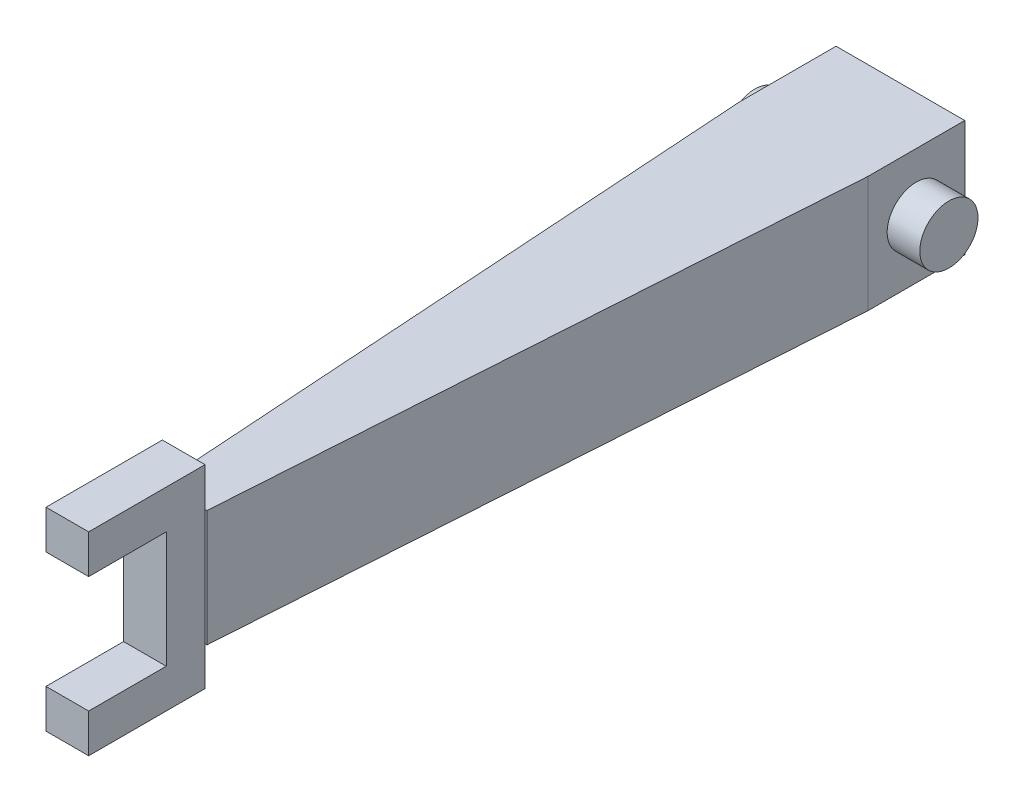
ISO-10303-21;
HEADER;
FILE_DESCRIPTION(('STEP AP214'),'2;1');
FILE_NAME('part.step','',(''),(''),'','','');
FILE_SCHEMA(('AUTOMOTIVE_DESIGN { 1 0 10303 214 1 1 1 1 }'));
ENDSEC;
DATA;
#1=APPLICATION_CONTEXT('core data for automotive mechanical design processes');
#2=APPLICATION_PROTOCOL_DEFINITION('international standard','automotive_design',2000,#1);
#3=PRODUCT_CONTEXT('',#1,'mechanical');
#4=PRODUCT('Part','Part','',(#3));
#5=PRODUCT_RELATED_PRODUCT_CATEGORY('part','',(#4));
#6=PRODUCT_DEFINITION_FORMATION('','',#4);
#7=PRODUCT_DEFINITION_CONTEXT('part definition',#1,'design');
#8=PRODUCT_DEFINITION('design','',#6,#7);
#9=PRODUCT_DEFINITION_SHAPE('','',#8);
#10=(LENGTH_UNIT() NAMED_UNIT(*) SI_UNIT(.MILLI.,.METRE.));
#11=(NAMED_UNIT(*) PLANE_ANGLE_UNIT() SI_UNIT($,.RADIAN.));
#12=(NAMED_UNIT(*) SI_UNIT($,.STERADIAN.) SOLID_ANGLE_UNIT());
#13=UNCERTAINTY_MEASURE_WITH_UNIT(LENGTH_MEASURE(1.E-05),#10,'distance_accuracy_value','');
#14=(GEOMETRIC_REPRESENTATION_CONTEXT(3) GLOBAL_UNCERTAINTY_ASSIGNED_CONTEXT((#13)) GLOBAL_UNIT_ASSIGNED_CONTEXT((#10,
#11,#12)) REPRESENTATION_CONTEXT('',''));
#15=CARTESIAN_POINT('',(0.,0.,0.));
#16=DIRECTION('',(0.,0.,1.));
#17=DIRECTION('',(1.,0.,0.));
#18=AXIS2_PLACEMENT_3D('',#15,#16,#17);
#19=CARTESIAN_POINT('',(0.,30.,159.755193944834));
#20=DIRECTION('',(0.,0.,-1.));
#21=DIRECTION('',(-1.,0.,0.));
#22=AXIS2_PLACEMENT_3D('',#19,#20,#21);
#23=PLANE('',#22);
#24=DIRECTION('',(0.,1.,0.));
#25=VECTOR('',#24,1.);
#26=CARTESIAN_POINT('',(5.5,40.,159.755193944834));
#27=LINE('',#26,#25);
#28=CARTESIAN_POINT('',(5.5,0.,159.755193944834));
#29=VERTEX_POINT('',#28);
#30=CARTESIAN_POINT('',(5.5,30.,159.755193944834));
#31=VERTEX_POINT('',#30);
#32=EDGE_CURVE('E44',#29,#31,#27,.T.);
#33=ORIENTED_EDGE('',*,*,#32,.F.);
#34=DIRECTION('',(1.,0.,0.));
#35=VECTOR('',#34,1.);
#36=CARTESIAN_POINT('',(0.,0.,159.755193944834));
#37=LINE('',#36,#35);
#38=CARTESIAN_POINT('',(5.98684043369972,0.,159.755193944834));
#39=VERTEX_POINT('',#38);
#40=EDGE_CURVE('E219',#29,#39,#37,.T.);
#41=ORIENTED_EDGE('',*,*,#40,.T.);
#42=DIRECTION('',(0.,-1.,0.));
#43=VECTOR('',#42,1.);
#44=CARTESIAN_POINT('',(5.98684043369972,30.,159.755193944834));
#45=LINE('',#44,#43);
#46=CARTESIAN_POINT('',(5.98684043369972,30.,159.755193944834));
#47=VERTEX_POINT('',#46);
#48=EDGE_CURVE('E226',#47,#39,#45,.T.);
#49=ORIENTED_EDGE('',*,*,#48,.F.);
#50=DIRECTION('',(1.,0.,0.));
#51=VECTOR('',#50,1.);
#52=CARTESIAN_POINT('',(0.,30.,159.755193944834));
#53=LINE('',#52,#51);
#54=EDGE_CURVE('E203',#31,#47,#53,.T.);
#55=ORIENTED_EDGE('',*,*,#54,.F.);
#56=EDGE_LOOP('',(#33,#41,#49,#55));
#57=FACE_BOUND('',#56,.T.);
#58=ADVANCED_FACE('F35',(#57),#23,.F.);
#59=CARTESIAN_POINT('',(16.585,30.,0.));
#60=DIRECTION('',(1.,0.,0.));
#61=DIRECTION('',(0.,0.,-1.));
#62=AXIS2_PLACEMENT_3D('',#59,#60,#61);
#63=PLANE('',#62);
#64=CARTESIAN_POINT('',(16.585,15.,-12.5));
#65=DIRECTION('',(1.,0.,0.));
#66=DIRECTION('',(0.,0.,-1.));
#67=AXIS2_PLACEMENT_3D('',#64,#65,#66);
#68=CIRCLE('',#67,7.5);
#69=CARTESIAN_POINT('',(16.585,15.,-20.));
#70=VERTEX_POINT('',#69);
#71=EDGE_CURVE('E187',#70,#70,#68,.F.);
#72=ORIENTED_EDGE('',*,*,#71,.T.);
#73=EDGE_LOOP('',(#72));
#74=FACE_BOUND('',#73,.T.);
#75=DIRECTION('',(0.,0.,1.));
#76=VECTOR('',#75,1.);
#77=CARTESIAN_POINT('',(16.585,0.,0.));
#78=LINE('',#77,#76);
#79=CARTESIAN_POINT('',(16.585,0.,-25.));
#80=VERTEX_POINT('',#79);
#81=CARTESIAN_POINT('',(16.585,0.,0.));
#82=VERTEX_POINT('',#81);
#83=EDGE_CURVE('E191',#80,#82,#78,.T.);
#84=ORIENTED_EDGE('',*,*,#83,.F.);
#85=DIRECTION('',(0.,-1.,0.));
#86=VECTOR('',#85,1.);
#87=CARTESIAN_POINT('',(16.585,30.,-25.));
#88=LINE('',#87,#86);
#89=CARTESIAN_POINT('',(16.585,30.,-25.));
#90=VERTEX_POINT('',#89);
#91=EDGE_CURVE('E236',#90,#80,#88,.T.);
#92=ORIENTED_EDGE('',*,*,#91,.F.);
#93=DIRECTION('',(0.,0.,1.));
#94=VECTOR('',#93,1.);
#95=CARTESIAN_POINT('',(16.585,30.,0.));
#96=LINE('',#95,#94);
#97=CARTESIAN_POINT('',(16.585,30.,0.));
#98=VERTEX_POINT('',#97);
#99=EDGE_CURVE('E192',#90,#98,#96,.T.);
#100=ORIENTED_EDGE('',*,*,#99,.T.);
#101=DIRECTION('',(0.,-1.,0.));
#102=VECTOR('',#101,1.);
#103=CARTESIAN_POINT('',(16.585,30.,0.));
#104=LINE('',#103,#102);
#105=EDGE_CURVE('E209',#98,#82,#104,.T.);
#106=ORIENTED_EDGE('',*,*,#105,.T.);
#107=EDGE_LOOP('',(#84,#92,#100,#106));
#108=FACE_BOUND('',#107,.T.);
#109=ADVANCED_FACE('F37',(#74,#108),#63,.T.);
#110=CARTESIAN_POINT('',(0.,30.,-25.));
#111=DIRECTION('',(0.,0.,-1.));
#112=DIRECTION('',(-1.,0.,0.));
#113=AXIS2_PLACEMENT_3D('',#110,#111,#112);
#114=PLANE('',#113);
#115=DIRECTION('',(1.,0.,0.));
#116=VECTOR('',#115,1.);
#117=CARTESIAN_POINT('',(0.,0.,-25.));
#118=LINE('',#117,#116);
#119=CARTESIAN_POINT('',(-16.585,0.,-25.));
#120=VERTEX_POINT('',#119);
#121=EDGE_CURVE('E212',#120,#80,#118,.T.);
#122=ORIENTED_EDGE('',*,*,#121,.F.);
#123=DIRECTION('',(0.,-1.,0.));
#124=VECTOR('',#123,1.);
#125=CARTESIAN_POINT('',(-16.585,30.,-25.));
#126=LINE('',#125,#124);
#127=CARTESIAN_POINT('',(-16.585,30.,-25.));
#128=VERTEX_POINT('',#127);
#129=EDGE_CURVE('E235',#128,#120,#126,.T.);
#130=ORIENTED_EDGE('',*,*,#129,.F.);
#131=DIRECTION('',(1.,0.,0.));
#132=VECTOR('',#131,1.);
#133=CARTESIAN_POINT('',(0.,30.,-25.));
#134=LINE('',#133,#132);
#135=EDGE_CURVE('E195',#128,#90,#134,.T.);
#136=ORIENTED_EDGE('',*,*,#135,.T.);
#137=ORIENTED_EDGE('',*,*,#91,.T.);
#138=EDGE_LOOP('',(#122,#130,#136,#137));
#139=FACE_BOUND('',#138,.T.);
#140=ADVANCED_FACE('F312',(#139),#114,.T.);
#141=CARTESIAN_POINT('',(-16.585,30.,0.));
#142=DIRECTION('',(1.,0.,0.));
#143=DIRECTION('',(0.,0.,-1.));
#144=AXIS2_PLACEMENT_3D('',#141,#142,#143);
#145=PLANE('',#144);
#146=CARTESIAN_POINT('',(-16.585,15.,-12.5));
#147=DIRECTION('',(1.,0.,0.));
#148=DIRECTION('',(0.,0.,-1.));
#149=AXIS2_PLACEMENT_3D('',#146,#147,#148);
#150=CIRCLE('',#149,7.5);
#151=CARTESIAN_POINT('',(-16.585,15.,-20.));
#152=VERTEX_POINT('',#151);
#153=EDGE_CURVE('E39',#152,#152,#150,.F.);
#154=ORIENTED_EDGE('',*,*,#153,.F.);
#155=EDGE_LOOP('',(#154));
#156=FACE_BOUND('',#155,.T.);
#157=DIRECTION('',(0.,0.,1.));
#158=VECTOR('',#157,1.);
#159=CARTESIAN_POINT('',(-16.585,0.,0.));
#160=LINE('',#159,#158);
#161=CARTESIAN_POINT('',(-16.585,0.,0.));
#162=VERTEX_POINT('',#161);
#163=EDGE_CURVE('E215',#120,#162,#160,.T.);
#164=ORIENTED_EDGE('',*,*,#163,.T.);
#165=DIRECTION('',(0.,-1.,0.));
#166=VECTOR('',#165,1.);
#167=CARTESIAN_POINT('',(-16.585,30.,0.));
#168=LINE('',#167,#166);
#169=CARTESIAN_POINT('',(-16.585,30.,0.));
#170=VERTEX_POINT('',#169);
#171=EDGE_CURVE('E232',#170,#162,#168,.T.);
#172=ORIENTED_EDGE('',*,*,#171,.F.);
#173=DIRECTION('',(0.,0.,1.));
#174=VECTOR('',#173,1.);
#175=CARTESIAN_POINT('',(-16.585,30.,0.));
#176=LINE('',#175,#174);
#177=EDGE_CURVE('E199',#128,#170,#176,.T.);
#178=ORIENTED_EDGE('',*,*,#177,.F.);
#179=ORIENTED_EDGE('',*,*,#129,.T.);
#180=EDGE_LOOP('',(#164,#172,#178,#179));
#181=FACE_BOUND('',#180,.T.);
#182=ADVANCED_FACE('F316',(#156,#181),#145,.F.);
#183=CARTESIAN_POINT('',(-16.512329311355,30.,1.09542792651529));
#184=DIRECTION('',(0.997806738949953,0.,-0.0661944990619399));
#185=DIRECTION('',(-0.0661944990619399,0.,-0.997806738949953));
#186=AXIS2_PLACEMENT_3D('',#183,#184,#185);
#187=PLANE('',#186);
#188=DIRECTION('',(0.0661944990619399,0.,0.997806738949953));
#189=VECTOR('',#188,1.);
#190=CARTESIAN_POINT('',(-16.512329311355,0.,1.09542792651529));
#191=LINE('',#190,#189);
#192=CARTESIAN_POINT('',(-5.98684043369972,0.,159.755193944834));
#193=VERTEX_POINT('',#192);
#194=EDGE_CURVE('E217',#162,#193,#191,.T.);
#195=ORIENTED_EDGE('',*,*,#194,.T.);
#196=DIRECTION('',(0.,-1.,0.));
#197=VECTOR('',#196,1.);
#198=CARTESIAN_POINT('',(-5.98684043369972,30.,159.755193944834));
#199=LINE('',#198,#197);
#200=CARTESIAN_POINT('',(-5.98684043369972,30.,159.755193944834));
#201=VERTEX_POINT('',#200);
#202=EDGE_CURVE('E229',#201,#193,#199,.T.);
#203=ORIENTED_EDGE('',*,*,#202,.F.);
#204=DIRECTION('',(0.0661944990619399,0.,0.997806738949953));
#205=VECTOR('',#204,1.);
#206=CARTESIAN_POINT('',(-16.512329311355,30.,1.09542792651529));
#207=LINE('',#206,#205);
#208=EDGE_CURVE('E201',#170,#201,#207,.T.);
#209=ORIENTED_EDGE('',*,*,#208,.F.);
#210=ORIENTED_EDGE('',*,*,#171,.T.);
#211=EDGE_LOOP('',(#195,#203,#209,#210));
#212=FACE_BOUND('',#211,.T.);
#213=ADVANCED_FACE('F321',(#212),#187,.F.);
#214=CARTESIAN_POINT('',(-5.5,0.,159.755193944834));
#215=VERTEX_POINT('',#214);
#216=EDGE_CURVE('E220',#193,#215,#37,.T.);
#217=ORIENTED_EDGE('',*,*,#216,.T.);
#218=DIRECTION('',(0.,1.,0.));
#219=VECTOR('',#218,1.);
#220=CARTESIAN_POINT('',(-5.5,40.,159.755193944834));
#221=LINE('',#220,#219);
#222=CARTESIAN_POINT('',(-5.5,30.,159.755193944834));
#223=VERTEX_POINT('',#222);
#224=EDGE_CURVE('E11',#215,#223,#221,.T.);
#225=ORIENTED_EDGE('',*,*,#224,.T.);
#226=EDGE_CURVE('E204',#201,#223,#53,.T.);
#227=ORIENTED_EDGE('',*,*,#226,.F.);
#228=ORIENTED_EDGE('',*,*,#202,.T.);
#229=EDGE_LOOP('',(#217,#225,#227,#228));
#230=FACE_BOUND('',#229,.T.);
#231=ADVANCED_FACE('F323',(#230),#23,.F.);
#232=CARTESIAN_POINT('',(16.512329311355,30.,1.09542792651529));
#233=DIRECTION('',(-0.997806738949953,0.,-0.0661944990619398));
#234=DIRECTION('',(-0.0661944990619398,0.,0.997806738949953));
#235=AXIS2_PLACEMENT_3D('',#232,#233,#234);
#236=PLANE('',#235);
#237=DIRECTION('',(0.0661944990619398,0.,-0.997806738949953));
#238=VECTOR('',#237,1.);
#239=CARTESIAN_POINT('',(16.512329311355,0.,1.09542792651529));
#240=LINE('',#239,#238);
#241=EDGE_CURVE('E196',#39,#82,#240,.T.);
#242=ORIENTED_EDGE('',*,*,#241,.T.);
#243=ORIENTED_EDGE('',*,*,#105,.F.);
#244=DIRECTION('',(0.0661944990619398,0.,-0.997806738949953));
#245=VECTOR('',#244,1.);
#246=CARTESIAN_POINT('',(16.512329311355,30.,1.09542792651529));
#247=LINE('',#246,#245);
#248=EDGE_CURVE('E206',#47,#98,#247,.T.);
#249=ORIENTED_EDGE('',*,*,#248,.F.);
#250=ORIENTED_EDGE('',*,*,#48,.T.);
#251=EDGE_LOOP('',(#242,#243,#249,#250));
#252=FACE_BOUND('',#251,.T.);
#253=ADVANCED_FACE('F303',(#252),#236,.F.);
#254=CARTESIAN_POINT('',(0.,30.,0.));
#255=DIRECTION('',(0.,1.,0.));
#256=DIRECTION('',(0.,0.,1.));
#257=AXIS2_PLACEMENT_3D('',#254,#255,#256);
#258=PLANE('',#257);
#259=ORIENTED_EDGE('',*,*,#99,.F.);
#260=ORIENTED_EDGE('',*,*,#135,.F.);
#261=ORIENTED_EDGE('',*,*,#177,.T.);
#262=ORIENTED_EDGE('',*,*,#208,.T.);
#263=ORIENTED_EDGE('',*,*,#226,.T.);
#264=EDGE_CURVE('E207',#223,#31,#53,.T.);
#265=ORIENTED_EDGE('',*,*,#264,.T.);
#266=ORIENTED_EDGE('',*,*,#54,.T.);
#267=ORIENTED_EDGE('',*,*,#248,.T.);
#268=EDGE_LOOP('',(#259,#260,#261,#262,#263,#265,#266,#267));
#269=FACE_BOUND('',#268,.T.);
#270=ADVANCED_FACE('F311',(#269),#258,.T.);
#271=CARTESIAN_POINT('',(0.,0.,0.));
#272=DIRECTION('',(0.,1.,0.));
#273=DIRECTION('',(0.,0.,1.));
#274=AXIS2_PLACEMENT_3D('',#271,#272,#273);
#275=PLANE('',#274);
#276=ORIENTED_EDGE('',*,*,#83,.T.);
#277=ORIENTED_EDGE('',*,*,#241,.F.);
#278=ORIENTED_EDGE('',*,*,#40,.F.);
#279=EDGE_CURVE('E222',#215,#29,#37,.T.);
#280=ORIENTED_EDGE('',*,*,#279,.F.);
#281=ORIENTED_EDGE('',*,*,#216,.F.);
#282=ORIENTED_EDGE('',*,*,#194,.F.);
#283=ORIENTED_EDGE('',*,*,#163,.F.);
#284=ORIENTED_EDGE('',*,*,#121,.T.);
#285=EDGE_LOOP('',(#276,#277,#278,#280,#281,#282,#283,#284));
#286=FACE_BOUND('',#285,.T.);
#287=ADVANCED_FACE('F305',(#286),#275,.F.);
#288=CARTESIAN_POINT('',(-25.,15.,-12.5));
#289=DIRECTION('',(1.,0.,0.));
#290=DIRECTION('',(0.,0.,-1.));
#291=AXIS2_PLACEMENT_3D('',#288,#289,#290);
#292=PLANE('',#291);
#293=CARTESIAN_POINT('',(-25.,15.,-12.5));
#294=DIRECTION('',(1.,0.,0.));
#295=DIRECTION('',(0.,0.,-1.));
#296=AXIS2_PLACEMENT_3D('',#293,#294,#295);
#297=CIRCLE('',#296,7.5);
#298=CARTESIAN_POINT('',(-25.,15.,-20.));
#299=VERTEX_POINT('',#298);
#300=EDGE_CURVE('E177',#299,#299,#297,.T.);
#301=ORIENTED_EDGE('',*,*,#300,.F.);
#302=EDGE_LOOP('',(#301));
#303=FACE_BOUND('',#302,.T.);
#304=ADVANCED_FACE('F360',(#303),#292,.F.);
#305=CARTESIAN_POINT('',(25.,15.,-12.5));
#306=DIRECTION('',(-1.,0.,0.));
#307=DIRECTION('',(0.,0.,1.));
#308=AXIS2_PLACEMENT_3D('',#305,#306,#307);
#309=CYLINDRICAL_SURFACE('',#308,7.5);
#310=ORIENTED_EDGE('',*,*,#300,.T.);
#311=EDGE_LOOP('',(#310));
#312=FACE_BOUND('',#311,.T.);
#313=ORIENTED_EDGE('',*,*,#153,.T.);
#314=EDGE_LOOP('',(#313));
#315=FACE_BOUND('',#314,.T.);
#316=ADVANCED_FACE('F346',(#312,#315),#309,.T.);
#317=ORIENTED_EDGE('',*,*,#71,.F.);
#318=EDGE_LOOP('',(#317));
#319=FACE_BOUND('',#318,.T.);
#320=CARTESIAN_POINT('',(25.,15.,-12.5));
#321=DIRECTION('',(1.,0.,0.));
#322=DIRECTION('',(0.,0.,-1.));
#323=AXIS2_PLACEMENT_3D('',#320,#321,#322);
#324=CIRCLE('',#323,7.5);
#325=CARTESIAN_POINT('',(25.,15.,-20.));
#326=VERTEX_POINT('',#325);
#327=EDGE_CURVE('E180',#326,#326,#324,.T.);
#328=ORIENTED_EDGE('',*,*,#327,.F.);
#329=EDGE_LOOP('',(#328));
#330=FACE_BOUND('',#329,.T.);
#331=ADVANCED_FACE('F342',(#319,#330),#309,.T.);
#332=CARTESIAN_POINT('',(25.,15.,-12.5));
#333=DIRECTION('',(1.,0.,0.));
#334=DIRECTION('',(0.,0.,-1.));
#335=AXIS2_PLACEMENT_3D('',#332,#333,#334);
#336=PLANE('',#335);
#337=ORIENTED_EDGE('',*,*,#327,.T.);
#338=EDGE_LOOP('',(#337));
#339=FACE_BOUND('',#338,.T.);
#340=ADVANCED_FACE('F345',(#339),#336,.T.);
#341=CARTESIAN_POINT('',(5.5,40.,159.755193944834));
#342=DIRECTION('',(0.,0.,1.));
#343=DIRECTION('',(1.,0.,0.));
#344=AXIS2_PLACEMENT_3D('',#341,#342,#343);
#345=PLANE('',#344);
#346=CARTESIAN_POINT('',(-5.5,-10.,159.755193944834));
#347=VERTEX_POINT('',#346);
#348=EDGE_CURVE('E46',#347,#215,#221,.T.);
#349=ORIENTED_EDGE('',*,*,#348,.T.);
#350=ORIENTED_EDGE('',*,*,#279,.T.);
#351=CARTESIAN_POINT('',(5.5,-10.,159.755193944834));
#352=VERTEX_POINT('',#351);
#353=EDGE_CURVE('E244',#352,#29,#27,.T.);
#354=ORIENTED_EDGE('',*,*,#353,.F.);
#355=DIRECTION('',(-1.,0.,0.));
#356=VECTOR('',#355,1.);
#357=CARTESIAN_POINT('',(5.5,-10.,159.755193944834));
#358=LINE('',#357,#356);
#359=EDGE_CURVE('E284',#352,#347,#358,.T.);
#360=ORIENTED_EDGE('',*,*,#359,.T.);
#361=EDGE_LOOP('',(#349,#350,#354,#360));
#362=FACE_BOUND('',#361,.T.);
#363=ADVANCED_FACE('F296',(#362),#345,.F.);
#364=CARTESIAN_POINT('',(5.5,30.,189.755193944834));
#365=DIRECTION('',(0.,0.,-1.));
#366=DIRECTION('',(-1.,0.,0.));
#367=AXIS2_PLACEMENT_3D('',#364,#365,#366);
#368=PLANE('',#367);
#369=DIRECTION('',(0.,-1.,0.));
#370=VECTOR('',#369,1.);
#371=CARTESIAN_POINT('',(-5.5,30.,189.755193944834));
#372=LINE('',#371,#370);
#373=CARTESIAN_POINT('',(-5.5,40.,189.755193944834));
#374=VERTEX_POINT('',#373);
#375=CARTESIAN_POINT('',(-5.5,30.,189.755193944834));
#376=VERTEX_POINT('',#375);
#377=EDGE_CURVE('E176',#374,#376,#372,.T.);
#378=ORIENTED_EDGE('',*,*,#377,.T.);
#379=DIRECTION('',(-1.,0.,0.));
#380=VECTOR('',#379,1.);
#381=CARTESIAN_POINT('',(5.5,30.,189.755193944834));
#382=LINE('',#381,#380);
#383=CARTESIAN_POINT('',(5.5,30.,189.755193944834));
#384=VERTEX_POINT('',#383);
#385=EDGE_CURVE('E156',#384,#376,#382,.T.);
#386=ORIENTED_EDGE('',*,*,#385,.F.);
#387=DIRECTION('',(0.,-1.,0.));
#388=VECTOR('',#387,1.);
#389=CARTESIAN_POINT('',(5.5,30.,189.755193944834));
#390=LINE('',#389,#388);
#391=CARTESIAN_POINT('',(5.5,40.,189.755193944834));
#392=VERTEX_POINT('',#391);
#393=EDGE_CURVE('E163',#392,#384,#390,.T.);
#394=ORIENTED_EDGE('',*,*,#393,.F.);
#395=DIRECTION('',(-1.,0.,0.));
#396=VECTOR('',#395,1.);
#397=CARTESIAN_POINT('',(5.5,40.,189.755193944834));
#398=LINE('',#397,#396);
#399=EDGE_CURVE('E541',#392,#374,#398,.T.);
#400=ORIENTED_EDGE('',*,*,#399,.T.);
#401=EDGE_LOOP('',(#378,#386,#394,#400));
#402=FACE_BOUND('',#401,.T.);
#403=ADVANCED_FACE('F174',(#402),#368,.F.);
#404=CARTESIAN_POINT('',(5.5,30.,169.755193944834));
#405=DIRECTION('',(0.,1.,0.));
#406=DIRECTION('',(0.,0.,1.));
#407=AXIS2_PLACEMENT_3D('',#404,#405,#406);
#408=PLANE('',#407);
#409=DIRECTION('',(0.,0.,-1.));
#410=VECTOR('',#409,1.);
#411=CARTESIAN_POINT('',(-5.5,30.,169.755193944834));
#412=LINE('',#411,#410);
#413=CARTESIAN_POINT('',(-5.5,30.,169.755193944834));
#414=VERTEX_POINT('',#413);
#415=EDGE_CURVE('E532',#376,#414,#412,.T.);
#416=ORIENTED_EDGE('',*,*,#415,.T.);
#417=DIRECTION('',(-1.,0.,0.));
#418=VECTOR('',#417,1.);
#419=CARTESIAN_POINT('',(5.5,30.,169.755193944834));
#420=LINE('',#419,#418);
#421=CARTESIAN_POINT('',(5.5,30.,169.755193944834));
#422=VERTEX_POINT('',#421);
#423=EDGE_CURVE('E159',#422,#414,#420,.T.);
#424=ORIENTED_EDGE('',*,*,#423,.F.);
#425=DIRECTION('',(0.,0.,-1.));
#426=VECTOR('',#425,1.);
#427=CARTESIAN_POINT('',(5.5,30.,169.755193944834));
#428=LINE('',#427,#426);
#429=EDGE_CURVE('E152',#384,#422,#428,.T.);
#430=ORIENTED_EDGE('',*,*,#429,.F.);
#431=ORIENTED_EDGE('',*,*,#385,.T.);
#432=EDGE_LOOP('',(#416,#424,#430,#431));
#433=FACE_BOUND('',#432,.T.);
#434=ADVANCED_FACE('F154',(#433),#408,.F.);
#435=CARTESIAN_POINT('',(5.5,0.,169.755193944834));
#436=DIRECTION('',(0.,0.,-1.));
#437=DIRECTION('',(-1.,0.,0.));
#438=AXIS2_PLACEMENT_3D('',#435,#436,#437);
#439=PLANE('',#438);
#440=DIRECTION('',(0.,-1.,0.));
#441=VECTOR('',#440,1.);
#442=CARTESIAN_POINT('',(-5.5,0.,169.755193944834));
#443=LINE('',#442,#441);
#444=CARTESIAN_POINT('',(-5.5,0.,169.755193944834));
#445=VERTEX_POINT('',#444);
#446=EDGE_CURVE('E266',#414,#445,#443,.T.);
#447=ORIENTED_EDGE('',*,*,#446,.T.);
#448=DIRECTION('',(-1.,0.,0.));
#449=VECTOR('',#448,1.);
#450=CARTESIAN_POINT('',(5.5,0.,169.755193944834));
#451=LINE('',#450,#449);
#452=CARTESIAN_POINT('',(5.5,0.,169.755193944834));
#453=VERTEX_POINT('',#452);
#454=EDGE_CURVE('E182',#453,#445,#451,.T.);
#455=ORIENTED_EDGE('',*,*,#454,.F.);
#456=DIRECTION('',(0.,-1.,0.));
#457=VECTOR('',#456,1.);
#458=CARTESIAN_POINT('',(5.5,0.,169.755193944834));
#459=LINE('',#458,#457);
#460=EDGE_CURVE('E162',#422,#453,#459,.T.);
#461=ORIENTED_EDGE('',*,*,#460,.F.);
#462=ORIENTED_EDGE('',*,*,#423,.T.);
#463=EDGE_LOOP('',(#447,#455,#461,#462));
#464=FACE_BOUND('',#463,.T.);
#465=ADVANCED_FACE('F264',(#464),#439,.F.);
#466=CARTESIAN_POINT('',(5.5,0.,189.755193944834));
#467=DIRECTION('',(0.,-1.,0.));
#468=DIRECTION('',(0.,0.,-1.));
#469=AXIS2_PLACEMENT_3D('',#466,#467,#468);
#470=PLANE('',#469);
#471=DIRECTION('',(0.,0.,1.));
#472=VECTOR('',#471,1.);
#473=CARTESIAN_POINT('',(-5.5,0.,189.755193944834));
#474=LINE('',#473,#472);
#475=CARTESIAN_POINT('',(-5.5,0.,189.755193944834));
#476=VERTEX_POINT('',#475);
#477=EDGE_CURVE('E273',#445,#476,#474,.T.);
#478=ORIENTED_EDGE('',*,*,#477,.T.);
#479=DIRECTION('',(-1.,0.,0.));
#480=VECTOR('',#479,1.);
#481=CARTESIAN_POINT('',(5.5,0.,189.755193944834));
#482=LINE('',#481,#480);
#483=CARTESIAN_POINT('',(5.5,0.,189.755193944834));
#484=VERTEX_POINT('',#483);
#485=EDGE_CURVE('E269',#484,#476,#482,.T.);
#486=ORIENTED_EDGE('',*,*,#485,.F.);
#487=DIRECTION('',(0.,0.,1.));
#488=VECTOR('',#487,1.);
#489=CARTESIAN_POINT('',(5.5,0.,189.755193944834));
#490=LINE('',#489,#488);
#491=EDGE_CURVE('E255',#453,#484,#490,.T.);
#492=ORIENTED_EDGE('',*,*,#491,.F.);
#493=ORIENTED_EDGE('',*,*,#454,.T.);
#494=EDGE_LOOP('',(#478,#486,#492,#493));
#495=FACE_BOUND('',#494,.T.);
#496=ADVANCED_FACE('F270',(#495),#470,.F.);
#497=CARTESIAN_POINT('',(5.5,-10.,189.755193944834));
#498=DIRECTION('',(0.,0.,-1.));
#499=DIRECTION('',(-1.,0.,0.));
#500=AXIS2_PLACEMENT_3D('',#497,#498,#499);
#501=PLANE('',#500);
#502=DIRECTION('',(0.,-1.,0.));
#503=VECTOR('',#502,1.);
#504=CARTESIAN_POINT('',(-5.5,-10.,189.755193944834));
#505=LINE('',#504,#503);
#506=CARTESIAN_POINT('',(-5.5,-10.,189.755193944834));
#507=VERTEX_POINT('',#506);
#508=EDGE_CURVE('E281',#476,#507,#505,.T.);
#509=ORIENTED_EDGE('',*,*,#508,.T.);
#510=DIRECTION('',(-1.,0.,0.));
#511=VECTOR('',#510,1.);
#512=CARTESIAN_POINT('',(5.5,-10.,189.755193944834));
#513=LINE('',#512,#511);
#514=CARTESIAN_POINT('',(5.5,-10.,189.755193944834));
#515=VERTEX_POINT('',#514);
#516=EDGE_CURVE('E276',#515,#507,#513,.T.);
#517=ORIENTED_EDGE('',*,*,#516,.F.);
#518=DIRECTION('',(0.,-1.,0.));
#519=VECTOR('',#518,1.);
#520=CARTESIAN_POINT('',(5.5,-10.,189.755193944834));
#521=LINE('',#520,#519);
#522=EDGE_CURVE('E252',#484,#515,#521,.T.);
#523=ORIENTED_EDGE('',*,*,#522,.F.);
#524=ORIENTED_EDGE('',*,*,#485,.T.);
#525=EDGE_LOOP('',(#509,#517,#523,#524));
#526=FACE_BOUND('',#525,.T.);
#527=ADVANCED_FACE('F279',(#526),#501,.F.);
#528=CARTESIAN_POINT('',(5.5,-10.,159.755193944834));
#529=DIRECTION('',(0.,1.,0.));
#530=DIRECTION('',(0.,0.,1.));
#531=AXIS2_PLACEMENT_3D('',#528,#529,#530);
#532=PLANE('',#531);
#533=DIRECTION('',(0.,0.,-1.));
#534=VECTOR('',#533,1.);
#535=CARTESIAN_POINT('',(-5.5,-10.,159.755193944834));
#536=LINE('',#535,#534);
#537=EDGE_CURVE('E289',#507,#347,#536,.T.);
#538=ORIENTED_EDGE('',*,*,#537,.T.);
#539=ORIENTED_EDGE('',*,*,#359,.F.);
#540=DIRECTION('',(0.,0.,-1.));
#541=VECTOR('',#540,1.);
#542=CARTESIAN_POINT('',(5.5,-10.,159.755193944834));
#543=LINE('',#542,#541);
#544=EDGE_CURVE('E249',#515,#352,#543,.T.);
#545=ORIENTED_EDGE('',*,*,#544,.F.);
#546=ORIENTED_EDGE('',*,*,#516,.T.);
#547=EDGE_LOOP('',(#538,#539,#545,#546));
#548=FACE_BOUND('',#547,.T.);
#549=ADVANCED_FACE('F286',(#548),#532,.F.);
#550=ORIENTED_EDGE('',*,*,#264,.F.);
#551=CARTESIAN_POINT('',(-5.5,40.,159.755193944834));
#552=VERTEX_POINT('',#551);
#553=EDGE_CURVE('E47',#223,#552,#221,.T.);
#554=ORIENTED_EDGE('',*,*,#553,.T.);
#555=DIRECTION('',(-1.,0.,0.));
#556=VECTOR('',#555,1.);
#557=CARTESIAN_POINT('',(5.5,40.,159.755193944834));
#558=LINE('',#557,#556);
#559=CARTESIAN_POINT('',(5.5,40.,159.755193944834));
#560=VERTEX_POINT('',#559);
#561=EDGE_CURVE('E293',#560,#552,#558,.T.);
#562=ORIENTED_EDGE('',*,*,#561,.F.);
#563=EDGE_CURVE('E245',#31,#560,#27,.T.);
#564=ORIENTED_EDGE('',*,*,#563,.F.);
#565=EDGE_LOOP('',(#550,#554,#562,#564));
#566=FACE_BOUND('',#565,.T.);
#567=ADVANCED_FACE('F356',(#566),#345,.F.);
#568=CARTESIAN_POINT('',(5.5,40.,189.755193944834));
#569=DIRECTION('',(0.,-1.,0.));
#570=DIRECTION('',(0.,0.,-1.));
#571=AXIS2_PLACEMENT_3D('',#568,#569,#570);
#572=PLANE('',#571);
#573=DIRECTION('',(0.,0.,1.));
#574=VECTOR('',#573,1.);
#575=CARTESIAN_POINT('',(-5.5,40.,189.755193944834));
#576=LINE('',#575,#574);
#577=EDGE_CURVE('E172',#552,#374,#576,.T.);
#578=ORIENTED_EDGE('',*,*,#577,.T.);
#579=ORIENTED_EDGE('',*,*,#399,.F.);
#580=DIRECTION('',(0.,0.,1.));
#581=VECTOR('',#580,1.);
#582=CARTESIAN_POINT('',(5.5,40.,189.755193944834));
#583=LINE('',#582,#581);
#584=EDGE_CURVE('E168',#560,#392,#583,.T.);
#585=ORIENTED_EDGE('',*,*,#584,.F.);
#586=ORIENTED_EDGE('',*,*,#561,.T.);
#587=EDGE_LOOP('',(#578,#579,#585,#586));
#588=FACE_BOUND('',#587,.T.);
#589=ADVANCED_FACE('F493',(#588),#572,.F.);
#590=CARTESIAN_POINT('',(5.5,0.,0.));
#591=DIRECTION('',(-1.,0.,0.));
#592=DIRECTION('',(0.,0.,1.));
#593=AXIS2_PLACEMENT_3D('',#590,#591,#592);
#594=PLANE('',#593);
#595=ORIENTED_EDGE('',*,*,#393,.T.);
#596=ORIENTED_EDGE('',*,*,#429,.T.);
#597=ORIENTED_EDGE('',*,*,#460,.T.);
#598=ORIENTED_EDGE('',*,*,#491,.T.);
#599=ORIENTED_EDGE('',*,*,#522,.T.);
#600=ORIENTED_EDGE('',*,*,#544,.T.);
#601=ORIENTED_EDGE('',*,*,#353,.T.);
#602=ORIENTED_EDGE('',*,*,#32,.T.);
#603=ORIENTED_EDGE('',*,*,#563,.T.);
#604=ORIENTED_EDGE('',*,*,#584,.T.);
#605=EDGE_LOOP('',(#595,#596,#597,#598,#599,#600,#601,#602,#603,#604));
#606=FACE_BOUND('',#605,.T.);
#607=ADVANCED_FACE('F166',(#606),#594,.F.);
#608=CARTESIAN_POINT('',(-5.5,0.,0.));
#609=DIRECTION('',(-1.,0.,0.));
#610=DIRECTION('',(0.,0.,1.));
#611=AXIS2_PLACEMENT_3D('',#608,#609,#610);
#612=PLANE('',#611);
#613=ORIENTED_EDGE('',*,*,#377,.F.);
#614=ORIENTED_EDGE('',*,*,#577,.F.);
#615=ORIENTED_EDGE('',*,*,#553,.F.);
#616=ORIENTED_EDGE('',*,*,#224,.F.);
#617=ORIENTED_EDGE('',*,*,#348,.F.);
#618=ORIENTED_EDGE('',*,*,#537,.F.);
#619=ORIENTED_EDGE('',*,*,#508,.F.);
#620=ORIENTED_EDGE('',*,*,#477,.F.);
#621=ORIENTED_EDGE('',*,*,#446,.F.);
#622=ORIENTED_EDGE('',*,*,#415,.F.);
#623=EDGE_LOOP('',(#613,#614,#615,#616,#617,#618,#619,#620,#621,#622));
#624=FACE_BOUND('',#623,.T.);
#625=ADVANCED_FACE('F509',(#624),#612,.T.);
#626=CLOSED_SHELL('',(#58,#109,#140,#182,#213,#231,#253,#270,#287,#304,#316,#331,#340,#363,#403,
#434,#465,#496,#527,#549,#567,#589,#607,#625));
#627=MANIFOLD_SOLID_BREP('B2',#626);
#628=ADVANCED_BREP_SHAPE_REPRESENTATION('',(#18,#627),#14);
#629=SHAPE_DEFINITION_REPRESENTATION(#9,#628);
ENDSEC;
END-ISO-10303-21;
